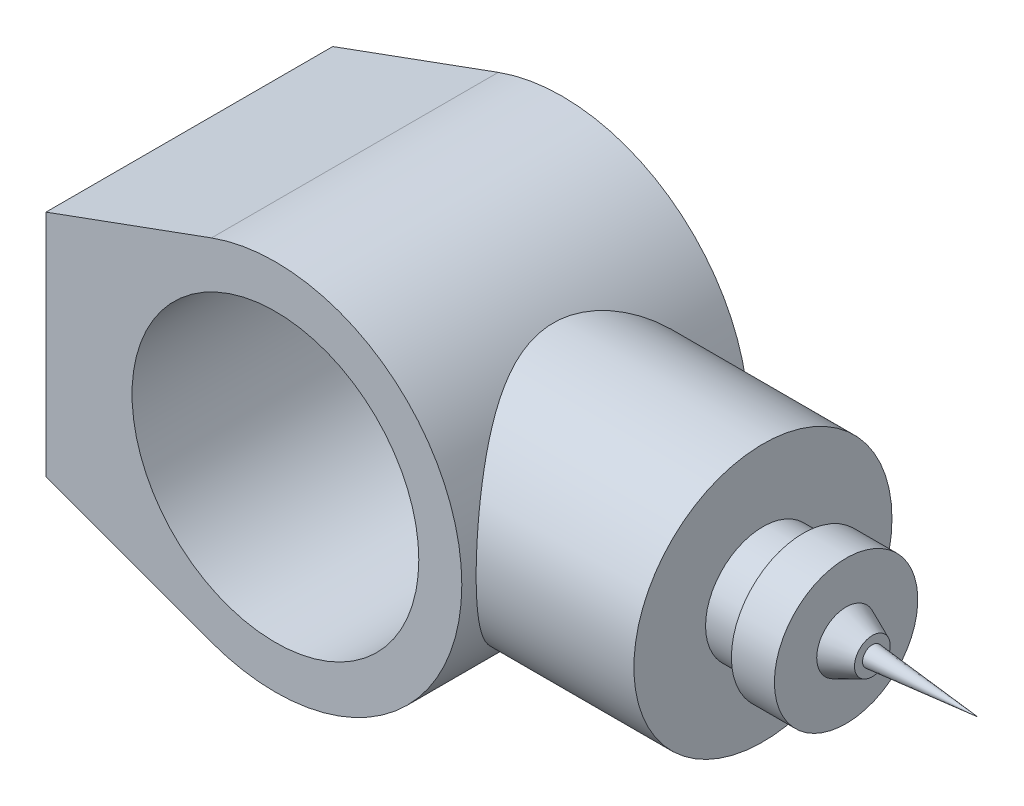
ISO-10303-21;
HEADER;
FILE_DESCRIPTION(('STEP AP214'),'2;1');
FILE_NAME('part.step','',(''),(''),'','','');
FILE_SCHEMA(('AUTOMOTIVE_DESIGN { 1 0 10303 214 1 1 1 1 }'));
ENDSEC;
DATA;
#1=APPLICATION_CONTEXT('core data for automotive mechanical design processes');
#2=APPLICATION_PROTOCOL_DEFINITION('international standard','automotive_design',2000,#1);
#3=PRODUCT_CONTEXT('',#1,'mechanical');
#4=PRODUCT('Part','Part','',(#3));
#5=PRODUCT_RELATED_PRODUCT_CATEGORY('part','',(#4));
#6=PRODUCT_DEFINITION_FORMATION('','',#4);
#7=PRODUCT_DEFINITION_CONTEXT('part definition',#1,'design');
#8=PRODUCT_DEFINITION('design','',#6,#7);
#9=PRODUCT_DEFINITION_SHAPE('','',#8);
#10=(LENGTH_UNIT() NAMED_UNIT(*) SI_UNIT(.MILLI.,.METRE.));
#11=(NAMED_UNIT(*) PLANE_ANGLE_UNIT() SI_UNIT($,.RADIAN.));
#12=(NAMED_UNIT(*) SI_UNIT($,.STERADIAN.) SOLID_ANGLE_UNIT());
#13=UNCERTAINTY_MEASURE_WITH_UNIT(LENGTH_MEASURE(1.E-05),#10,'distance_accuracy_value','');
#14=(GEOMETRIC_REPRESENTATION_CONTEXT(3) GLOBAL_UNCERTAINTY_ASSIGNED_CONTEXT((#13)) GLOBAL_UNIT_ASSIGNED_CONTEXT((#10,
#11,#12)) REPRESENTATION_CONTEXT('',''));
#15=CARTESIAN_POINT('',(0.,0.,0.));
#16=DIRECTION('',(0.,0.,1.));
#17=DIRECTION('',(1.,0.,0.));
#18=AXIS2_PLACEMENT_3D('',#15,#16,#17);
#19=CARTESIAN_POINT('',(0.,0.,50.));
#20=DIRECTION('',(0.,0.,1.));
#21=DIRECTION('',(1.,0.,0.));
#22=AXIS2_PLACEMENT_3D('',#19,#20,#21);
#23=PLANE('',#22);
#24=DIRECTION('',(-0.939410286372225,-0.342794856813887,0.));
#25=VECTOR('',#24,1.);
#26=CARTESIAN_POINT('',(-80.,40.,50.));
#27=LINE('',#26,#25);
#28=CARTESIAN_POINT('',(-22.2816656929027,61.0616686141947,50.));
#29=VERTEX_POINT('',#28);
#30=CARTESIAN_POINT('',(-80.,40.,50.));
#31=VERTEX_POINT('',#30);
#32=EDGE_CURVE('E200',#29,#31,#27,.T.);
#33=ORIENTED_EDGE('',*,*,#32,.T.);
#34=DIRECTION('',(0.,-1.,0.));
#35=VECTOR('',#34,1.);
#36=CARTESIAN_POINT('',(-80.,-40.,50.));
#37=LINE('',#36,#35);
#38=CARTESIAN_POINT('',(-80.,-40.,50.));
#39=VERTEX_POINT('',#38);
#40=EDGE_CURVE('E91',#31,#39,#37,.T.);
#41=ORIENTED_EDGE('',*,*,#40,.T.);
#42=DIRECTION('',(0.939410286372225,-0.342794856813887,0.));
#43=VECTOR('',#42,1.);
#44=CARTESIAN_POINT('',(-80.,-40.,50.));
#45=LINE('',#44,#43);
#46=CARTESIAN_POINT('',(-22.2816656929027,-61.0616686141947,50.));
#47=VERTEX_POINT('',#46);
#48=EDGE_CURVE('E193',#39,#47,#45,.T.);
#49=ORIENTED_EDGE('',*,*,#48,.T.);
#50=CARTESIAN_POINT('',(0.,0.,50.));
#51=DIRECTION('',(0.,0.,1.));
#52=DIRECTION('',(1.,0.,0.));
#53=AXIS2_PLACEMENT_3D('',#50,#51,#52);
#54=CIRCLE('',#53,65.);
#55=EDGE_CURVE('E60',#47,#29,#54,.T.);
#56=ORIENTED_EDGE('',*,*,#55,.T.);
#57=EDGE_LOOP('',(#33,#41,#49,#56));
#58=FACE_BOUND('',#57,.T.);
#59=CARTESIAN_POINT('',(0.,0.,50.));
#60=DIRECTION('',(0.,0.,1.));
#61=DIRECTION('',(1.,0.,0.));
#62=AXIS2_PLACEMENT_3D('',#59,#60,#61);
#63=CIRCLE('',#62,50.);
#64=CARTESIAN_POINT('',(50.,0.,50.));
#65=VERTEX_POINT('',#64);
#66=EDGE_CURVE('E215',#65,#65,#63,.T.);
#67=ORIENTED_EDGE('',*,*,#66,.F.);
#68=EDGE_LOOP('',(#67));
#69=FACE_BOUND('',#68,.T.);
#70=ADVANCED_FACE('F42',(#58,#69),#23,.T.);
#71=CARTESIAN_POINT('',(0.,0.,-50.));
#72=DIRECTION('',(0.,0.,1.));
#73=DIRECTION('',(1.,0.,0.));
#74=AXIS2_PLACEMENT_3D('',#71,#72,#73);
#75=PLANE('',#74);
#76=DIRECTION('',(-0.939410286372225,-0.342794856813887,0.));
#77=VECTOR('',#76,1.);
#78=CARTESIAN_POINT('',(-80.,40.,-50.));
#79=LINE('',#78,#77);
#80=CARTESIAN_POINT('',(-22.2816656929027,61.0616686141947,-50.));
#81=VERTEX_POINT('',#80);
#82=CARTESIAN_POINT('',(-80.,40.,-50.));
#83=VERTEX_POINT('',#82);
#84=EDGE_CURVE('E191',#81,#83,#79,.T.);
#85=ORIENTED_EDGE('',*,*,#84,.F.);
#86=CARTESIAN_POINT('',(0.,0.,-50.));
#87=DIRECTION('',(0.,0.,1.));
#88=DIRECTION('',(1.,0.,0.));
#89=AXIS2_PLACEMENT_3D('',#86,#87,#88);
#90=CIRCLE('',#89,65.);
#91=CARTESIAN_POINT('',(-22.2816656929027,-61.0616686141947,-50.));
#92=VERTEX_POINT('',#91);
#93=EDGE_CURVE('E84',#92,#81,#90,.T.);
#94=ORIENTED_EDGE('',*,*,#93,.F.);
#95=DIRECTION('',(0.939410286372225,-0.342794856813887,0.));
#96=VECTOR('',#95,1.);
#97=CARTESIAN_POINT('',(-80.,-40.,-50.));
#98=LINE('',#97,#96);
#99=CARTESIAN_POINT('',(-80.,-40.,-50.));
#100=VERTEX_POINT('',#99);
#101=EDGE_CURVE('E78',#100,#92,#98,.T.);
#102=ORIENTED_EDGE('',*,*,#101,.F.);
#103=DIRECTION('',(0.,-1.,0.));
#104=VECTOR('',#103,1.);
#105=CARTESIAN_POINT('',(-80.,-40.,-50.));
#106=LINE('',#105,#104);
#107=EDGE_CURVE('E185',#83,#100,#106,.T.);
#108=ORIENTED_EDGE('',*,*,#107,.F.);
#109=EDGE_LOOP('',(#85,#94,#102,#108));
#110=FACE_BOUND('',#109,.T.);
#111=CARTESIAN_POINT('',(0.,0.,-50.));
#112=DIRECTION('',(0.,0.,1.));
#113=DIRECTION('',(1.,0.,0.));
#114=AXIS2_PLACEMENT_3D('',#111,#112,#113);
#115=CIRCLE('',#114,50.);
#116=CARTESIAN_POINT('',(50.,0.,-50.));
#117=VERTEX_POINT('',#116);
#118=EDGE_CURVE('E218',#117,#117,#115,.T.);
#119=ORIENTED_EDGE('',*,*,#118,.T.);
#120=EDGE_LOOP('',(#119));
#121=FACE_BOUND('',#120,.T.);
#122=ADVANCED_FACE('F165',(#110,#121),#75,.F.);
#123=CARTESIAN_POINT('',(-80.,40.,50.));
#124=DIRECTION('',(0.342794856813887,-0.939410286372225,0.));
#125=DIRECTION('',(0.939410286372225,0.342794856813887,0.));
#126=AXIS2_PLACEMENT_3D('',#123,#124,#125);
#127=PLANE('',#126);
#128=ORIENTED_EDGE('',*,*,#84,.T.);
#129=DIRECTION('',(0.,0.,-1.));
#130=VECTOR('',#129,1.);
#131=CARTESIAN_POINT('',(-80.,40.,50.));
#132=LINE('',#131,#130);
#133=EDGE_CURVE('E11',#31,#83,#132,.T.);
#134=ORIENTED_EDGE('',*,*,#133,.F.);
#135=ORIENTED_EDGE('',*,*,#32,.F.);
#136=DIRECTION('',(0.,0.,-1.));
#137=VECTOR('',#136,1.);
#138=CARTESIAN_POINT('',(-22.2816656929027,61.0616686141947,50.));
#139=LINE('',#138,#137);
#140=EDGE_CURVE('E204',#29,#81,#139,.T.);
#141=ORIENTED_EDGE('',*,*,#140,.T.);
#142=EDGE_LOOP('',(#128,#134,#135,#141));
#143=FACE_BOUND('',#142,.T.);
#144=ADVANCED_FACE('F44',(#143),#127,.F.);
#145=CARTESIAN_POINT('',(-80.,-40.,50.));
#146=DIRECTION('',(1.,0.,0.));
#147=DIRECTION('',(0.,0.,-1.));
#148=AXIS2_PLACEMENT_3D('',#145,#146,#147);
#149=PLANE('',#148);
#150=ORIENTED_EDGE('',*,*,#107,.T.);
#151=DIRECTION('',(0.,0.,-1.));
#152=VECTOR('',#151,1.);
#153=CARTESIAN_POINT('',(-80.,-40.,50.));
#154=LINE('',#153,#152);
#155=EDGE_CURVE('E52',#39,#100,#154,.T.);
#156=ORIENTED_EDGE('',*,*,#155,.F.);
#157=ORIENTED_EDGE('',*,*,#40,.F.);
#158=ORIENTED_EDGE('',*,*,#133,.T.);
#159=EDGE_LOOP('',(#150,#156,#157,#158));
#160=FACE_BOUND('',#159,.T.);
#161=ADVANCED_FACE('F179',(#160),#149,.F.);
#162=CARTESIAN_POINT('',(-80.,-40.,50.));
#163=DIRECTION('',(0.342794856813887,0.939410286372225,0.));
#164=DIRECTION('',(-0.939410286372225,0.342794856813887,0.));
#165=AXIS2_PLACEMENT_3D('',#162,#163,#164);
#166=PLANE('',#165);
#167=ORIENTED_EDGE('',*,*,#101,.T.);
#168=DIRECTION('',(0.,0.,-1.));
#169=VECTOR('',#168,1.);
#170=CARTESIAN_POINT('',(-22.2816656929027,-61.0616686141947,50.));
#171=LINE('',#170,#169);
#172=EDGE_CURVE('E195',#47,#92,#171,.T.);
#173=ORIENTED_EDGE('',*,*,#172,.F.);
#174=ORIENTED_EDGE('',*,*,#48,.F.);
#175=ORIENTED_EDGE('',*,*,#155,.T.);
#176=EDGE_LOOP('',(#167,#173,#174,#175));
#177=FACE_BOUND('',#176,.T.);
#178=ADVANCED_FACE('F176',(#177),#166,.F.);
#179=CARTESIAN_POINT('',(0.,0.,50.));
#180=DIRECTION('',(0.,0.,-1.));
#181=DIRECTION('',(-1.,0.,0.));
#182=AXIS2_PLACEMENT_3D('',#179,#180,#181);
#183=CYLINDRICAL_SURFACE('',#182,65.);
#184=CARTESIAN_POINT('',(65.,0.,-45.));
#185=CARTESIAN_POINT('',(65.0000011696057,1.12147330120565,-45.0000012025283));
#186=CARTESIAN_POINT('',(64.9709159765212,2.24292945230778,-44.9580201602482));
#187=CARTESIAN_POINT('',(64.8553068641383,4.47658414079082,-44.790785609369));
#188=CARTESIAN_POINT('',(64.7687842573088,5.58878288911931,-44.6655340035371));
#189=CARTESIAN_POINT('',(64.5403785763001,7.79555151848628,-44.3336771879691));
#190=CARTESIAN_POINT('',(64.3984760503456,8.89011506447751,-44.1270433931238));
#191=CARTESIAN_POINT('',(64.0626457436966,11.0533096019768,-43.6354760134034));
#192=CARTESIAN_POINT('',(63.8687169569864,12.1219400915896,-43.3505409144375));
#193=CARTESIAN_POINT('',(63.4342222744662,14.2212125160505,-42.7078017297046));
#194=CARTESIAN_POINT('',(63.1938918545645,15.2520162370063,-42.3503651251477));
#195=CARTESIAN_POINT('',(62.6709259446924,17.2756280115286,-41.5659763086892));
#196=CARTESIAN_POINT('',(62.3882907364915,18.268436318107,-41.1390245597888));
#197=CARTESIAN_POINT('',(61.786108553932,20.2116697228795,-40.2199419970838));
#198=CARTESIAN_POINT('',(61.4665619062631,21.1620951960855,-39.7278117601444));
#199=CARTESIAN_POINT('',(60.7962171584065,23.0172309124314,-38.6825647509799));
#200=CARTESIAN_POINT('',(60.4454175300334,23.9219389167185,-38.1294449962195));
#201=CARTESIAN_POINT('',(59.6865648974474,25.7601880140228,-36.9151737617935));
#202=CARTESIAN_POINT('',(59.27618815402,26.6893215363404,-36.2488040005491));
#203=CARTESIAN_POINT('',(58.4330275057249,28.4880338622967,-34.8529502059224));
#204=CARTESIAN_POINT('',(58.0002425478181,29.3576098626539,-34.1234632053608));
#205=CARTESIAN_POINT('',(57.1195111836477,31.0364486388513,-32.6040251352403));
#206=CARTESIAN_POINT('',(56.6715447181891,31.8456267033451,-31.8139921794123));
#207=CARTESIAN_POINT('',(55.7691986061138,33.4006700551814,-30.1773036556993));
#208=CARTESIAN_POINT('',(55.3148185876119,34.1465316534289,-29.3306447936721));
#209=CARTESIAN_POINT('',(54.3303114345595,35.6959084068904,-27.4326466159468));
#210=CARTESIAN_POINT('',(53.8005937511269,36.4872853280241,-26.3711450656527));
#211=CARTESIAN_POINT('',(52.7593327891933,37.9773509509911,-24.17604025639));
#212=CARTESIAN_POINT('',(52.2477941160227,38.6760162868262,-23.0424189272517));
#213=CARTESIAN_POINT('',(51.2608149265043,39.9749077721744,-20.7072341856928));
#214=CARTESIAN_POINT('',(50.7853275075273,40.5752630453964,-19.5057627267967));
#215=CARTESIAN_POINT('',(49.8892399163793,41.6721166930025,-17.036931864064));
#216=CARTESIAN_POINT('',(49.4686114171658,42.1686687478853,-15.7696069409943));
#217=CARTESIAN_POINT('',(48.8208029416879,42.9149535309565,-13.5723996352816));
#218=CARTESIAN_POINT('',(48.5738420263557,43.1936925213245,-12.6581208440976));
#219=CARTESIAN_POINT('',(48.1238801744123,43.6944569649788,-10.8035389223551));
#220=CARTESIAN_POINT('',(47.9208721021929,43.9164916250901,-9.86324004407419));
#221=CARTESIAN_POINT('',(47.5660754926548,44.3005296261305,-7.96250438663409));
#222=CARTESIAN_POINT('',(47.4142038087044,44.4626304606427,-7.00210302149487));
#223=CARTESIAN_POINT('',(47.1671263845177,44.7246555122386,-5.06554052628518));
#224=CARTESIAN_POINT('',(47.0719206259529,44.824579749433,-4.08937940131224));
#225=CARTESIAN_POINT('',(46.9418899090943,44.9607388198673,-2.1232364847967));
#226=CARTESIAN_POINT('',(46.9073939345417,44.9966266570423,-1.13320851844658));
#227=CARTESIAN_POINT('',(46.9013571135476,45.0029190462422,0.847248377093852));
#228=CARTESIAN_POINT('',(46.9298161498631,44.9733237202183,1.837677305534));
#229=CARTESIAN_POINT('',(47.0484302849821,44.8492190899201,3.81128752429081));
#230=CARTESIAN_POINT('',(47.13862305521,44.7546701492421,4.79446401850661));
#231=CARTESIAN_POINT('',(47.3768313176079,44.5024241630868,6.74551496467455));
#232=CARTESIAN_POINT('',(47.5248480621437,44.3447257499009,7.71338908473168));
#233=CARTESIAN_POINT('',(47.8621764271841,43.9803320764262,9.56919366964684));
#234=CARTESIAN_POINT('',(48.0484149088864,43.7772163066585,10.4583970625519));
#235=CARTESIAN_POINT('',(48.4609441046406,43.32010640119,12.2144143492181));
#236=CARTESIAN_POINT('',(48.6872496045115,43.0660934784815,13.0812198417583));
#237=CARTESIAN_POINT('',(49.1738509640383,42.5096331932465,14.7898225666927));
#238=CARTESIAN_POINT('',(49.4341648638834,42.2071601049958,15.6316062329481));
#239=CARTESIAN_POINT('',(49.9825182796335,41.5563350032134,17.2876417419013));
#240=CARTESIAN_POINT('',(50.2705534011697,41.2079902580444,18.1018979206949));
#241=CARTESIAN_POINT('',(51.0225431471345,40.2767822129268,20.1137766396802));
#242=CARTESIAN_POINT('',(51.5007434523328,39.6654891440572,21.2930273345177));
#243=CARTESIAN_POINT('',(52.4891158781477,38.348029920852,23.5833678403921));
#244=CARTESIAN_POINT('',(52.9993005340589,37.6418264436726,24.6944305853524));
#245=CARTESIAN_POINT('',(54.0361557973494,36.1376496350166,26.8476775780095));
#246=CARTESIAN_POINT('',(54.5628535785461,35.3395185623559,27.8897384505711));
#247=CARTESIAN_POINT('',(55.6171804467178,33.6558443419671,29.8998791095632));
#248=CARTESIAN_POINT('',(56.1448094104418,32.7703120184234,30.8679680307498));
#249=CARTESIAN_POINT('',(57.1932449701135,30.9045304086319,32.7363921475659));
#250=CARTESIAN_POINT('',(57.7139191350983,29.9233731295192,33.6358963165067));
#251=CARTESIAN_POINT('',(58.7296419536465,27.8771206485979,35.350355349792));
#252=CARTESIAN_POINT('',(59.2246882700661,26.8120178135979,36.1653025097018));
#253=CARTESIAN_POINT('',(60.1756566955639,24.6035209522421,37.7024332048813));
#254=CARTESIAN_POINT('',(60.6316475651595,23.4602711709794,38.4247809320632));
#255=CARTESIAN_POINT('',(61.4931891608211,21.0989507187335,39.7703323765769));
#256=CARTESIAN_POINT('',(61.898755017873,19.8809026570889,40.3935658507715));
#257=CARTESIAN_POINT('',(62.5646802947783,17.6549035875762,41.4059204565395));
#258=CARTESIAN_POINT('',(62.8372982548467,16.6602403417733,41.8163120535009));
#259=CARTESIAN_POINT('',(63.3397164077328,14.6345031625144,42.5675669112335));
#260=CARTESIAN_POINT('',(63.569522535998,13.603434299959,42.9084398107234));
#261=CARTESIAN_POINT('',(63.9815049902596,11.5110112910016,43.5164676119118));
#262=CARTESIAN_POINT('',(64.1637052650743,10.4496726714621,43.7836595836378));
#263=CARTESIAN_POINT('',(64.476639865795,8.30296993183371,44.2409869387356));
#264=CARTESIAN_POINT('',(64.6073730982257,7.21760530180254,44.431120684921));
#265=CARTESIAN_POINT('',(64.8147345736682,5.02649787175023,44.7321113931983));
#266=CARTESIAN_POINT('',(64.8911534961694,3.92069290489763,44.8426616714377));
#267=CARTESIAN_POINT('',(64.9872183357685,1.70145350776208,44.981563734156));
#268=CARTESIAN_POINT('',(65.0068642771874,0.588019080747696,45.0099155538474));
#269=CARTESIAN_POINT('',(64.9889001241945,-1.63741781931566,44.9839662509349));
#270=CARTESIAN_POINT('',(64.9512898349751,-2.74942028747967,44.929664847113));
#271=CARTESIAN_POINT('',(64.819734418053,-4.96298947367603,44.7392747901952));
#272=CARTESIAN_POINT('',(64.7257910494465,-6.06455651648127,44.6031886909653));
#273=CARTESIAN_POINT('',(64.491175703309,-8.18254449212149,44.2620157992034));
#274=CARTESIAN_POINT('',(64.3536808680178,-9.20007959997774,44.0616107864454));
#275=CARTESIAN_POINT('',(64.0337856060908,-11.2121337136589,43.5930613516679));
#276=CARTESIAN_POINT('',(63.8513873855499,-12.2066538475799,43.3249202574929));
#277=CARTESIAN_POINT('',(63.4451725249075,-14.1673074608523,42.7239854011605));
#278=CARTESIAN_POINT('',(63.2213525684632,-15.1334386601223,42.3911864622047));
#279=CARTESIAN_POINT('',(62.736336352677,-17.0327019487273,41.6643868113868));
#280=CARTESIAN_POINT('',(62.4751380044848,-17.965832190203,41.2703826790343));
#281=CARTESIAN_POINT('',(61.8990085085122,-19.8637431772395,40.3931275129008));
#282=CARTESIAN_POINT('',(61.5815209528501,-20.8256806929253,39.9054081529014));
#283=CARTESIAN_POINT('',(60.9142086391395,-22.7035764997345,38.8677076181211));
#284=CARTESIAN_POINT('',(60.5643826081083,-23.6195329786528,38.3177239921568));
#285=CARTESIAN_POINT('',(59.8381347129401,-25.4032558353403,37.1592008079418));
#286=CARTESIAN_POINT('',(59.4616987975441,-26.270996314329,36.5506302507532));
#287=CARTESIAN_POINT('',(58.6884577670336,-27.9557544991496,35.2787474176625));
#288=CARTESIAN_POINT('',(58.2916515549571,-28.7727694681138,34.6154321925309));
#289=CARTESIAN_POINT('',(57.4151711853793,-30.4889708749912,33.1199200847161));
#290=CARTESIAN_POINT('',(56.9328754552547,-31.3785212006928,32.2781812569548));
#291=CARTESIAN_POINT('',(55.9590893109094,-33.0839042215169,30.5278352445589));
#292=CARTESIAN_POINT('',(55.4675975421249,-33.8997259516808,29.6192181500899));
#293=CARTESIAN_POINT('',(54.4860350387397,-35.45586994741,27.7375714933993));
#294=CARTESIAN_POINT('',(53.9959654596117,-36.1961418986443,26.7644997080007));
#295=CARTESIAN_POINT('',(53.0294834997435,-37.5978502361011,24.7568233036382));
#296=CARTESIAN_POINT('',(52.553069328415,-38.2592969946585,23.7222268074148));
#297=CARTESIAN_POINT('',(51.679941347726,-39.4291013564639,21.7149007388747));
#298=CARTESIAN_POINT('',(51.2803372484816,-39.9463152685162,20.7485884228094));
#299=CARTESIAN_POINT('',(50.5123974548912,-40.9130636661729,18.7705314851885));
#300=CARTESIAN_POINT('',(50.1440619804653,-41.3625976757848,17.7587865441704));
#301=CARTESIAN_POINT('',(49.4504928922364,-42.1893301292689,15.693797265063));
#302=CARTESIAN_POINT('',(49.1251906412473,-42.566644202947,14.6406225749502));
#303=CARTESIAN_POINT('',(48.5290098021012,-43.2451098617227,12.4950157035289));
#304=CARTESIAN_POINT('',(48.2581179989952,-43.5462799449171,11.4025931307277));
#305=CARTESIAN_POINT('',(47.8271610412375,-44.0186874861181,9.3921629994351));
#306=CARTESIAN_POINT('',(47.6558419905218,-44.2036946073207,8.47979353570419));
#307=CARTESIAN_POINT('',(47.3627606953031,-44.517583244497,6.63757582668245));
#308=CARTESIAN_POINT('',(47.2409923142224,-44.6464717105955,5.70772976070373));
#309=CARTESIAN_POINT('',(47.05166615705,-44.8459556683364,3.83718735816971));
#310=CARTESIAN_POINT('',(46.9840561376509,-44.9166073394187,2.89650236820514));
#311=CARTESIAN_POINT('',(46.9055698265682,-44.9985645522097,1.01014116515035));
#312=CARTESIAN_POINT('',(46.894694331428,-45.0098692606967,0.0644648821697862));
#313=CARTESIAN_POINT('',(46.9301408777119,-44.972908524549,-1.82506201386804));
#314=CARTESIAN_POINT('',(46.9764888551696,-44.9246160680299,-2.76891160474201));
#315=CARTESIAN_POINT('',(47.1245232303033,-44.7693052695385,-4.64731891289862));
#316=CARTESIAN_POINT('',(47.226209296244,-44.6622872796082,-5.58187668584874));
#317=CARTESIAN_POINT('',(47.4811423262629,-44.3911660407895,-7.43666598606561));
#318=CARTESIAN_POINT('',(47.634452919394,-44.2269923369625,-8.35687836049678));
#319=CARTESIAN_POINT('',(47.9871889035597,-43.8440109221367,-10.1768310643423));
#320=CARTESIAN_POINT('',(48.1866204648689,-43.6251959006593,-11.0765686368372));
#321=CARTESIAN_POINT('',(48.6908782922366,-43.0625185245671,-13.116726178063));
#322=CARTESIAN_POINT('',(49.0093972350599,-42.7008255731353,-14.2488681052183));
#323=CARTESIAN_POINT('',(49.699554494161,-41.8955268796886,-16.4668795226373));
#324=CARTESIAN_POINT('',(50.0712093704162,-41.4518955887103,-17.5527344499461));
#325=CARTESIAN_POINT('',(50.8544123719762,-40.4872212981013,-19.6760329984318));
#326=CARTESIAN_POINT('',(51.2660067549033,-39.9660881554129,-20.7134183727638));
#327=CARTESIAN_POINT('',(52.116211879306,-38.8508952329155,-22.7363587217865));
#328=CARTESIAN_POINT('',(52.5548209260535,-38.2568400254561,-23.7219169406072));
#329=CARTESIAN_POINT('',(53.4579357785502,-36.9847423381263,-25.6613286822633));
#330=CARTESIAN_POINT('',(53.9228021101371,-36.3051118639051,-26.6139712103077));
#331=CARTESIAN_POINT('',(54.8583333343946,-34.8753950985048,-28.4617532840731));
#332=CARTESIAN_POINT('',(55.3289982185488,-34.1253089107936,-29.3568929142368));
#333=CARTESIAN_POINT('',(56.2664339133503,-32.5564691651912,-31.0876310121466));
#334=CARTESIAN_POINT('',(56.7332035093429,-31.7376950080829,-31.923211478402));
#335=CARTESIAN_POINT('',(57.6535165855435,-30.033481652025,-33.5315189390535));
#336=CARTESIAN_POINT('',(58.1070588196762,-29.1480362003111,-34.3042400240121));
#337=CARTESIAN_POINT('',(59.0635284336244,-27.1643113596245,-35.9022819462667));
#338=CARTESIAN_POINT('',(59.5626106290919,-26.0547472869609,-36.7159606163356));
#339=CARTESIAN_POINT('',(60.5176757229357,-23.7521280348398,-38.2458641369291));
#340=CARTESIAN_POINT('',(60.9736519283074,-22.5590599397198,-38.962073861155));
#341=CARTESIAN_POINT('',(61.6149926579414,-20.7127348127311,-39.9558623322098));
#342=CARTESIAN_POINT('',(61.8215919655179,-20.088110583999,-40.2735888165198));
#343=CARTESIAN_POINT('',(62.2191547005856,-18.8206694867556,-40.8812436548858));
#344=CARTESIAN_POINT('',(62.4101203779565,-18.1778552539997,-41.1711760099034));
#345=CARTESIAN_POINT('',(62.7748527233683,-16.875283117665,-41.7219931318356));
#346=CARTESIAN_POINT('',(62.9486230408552,-16.2155288469421,-41.9828840638124));
#347=CARTESIAN_POINT('',(63.2775356475737,-14.8804011558233,-42.4744610119283));
#348=CARTESIAN_POINT('',(63.432679284421,-14.2050288695917,-42.7051492133046));
#349=CARTESIAN_POINT('',(63.8070721968101,-12.4447010544915,-43.25974494481));
#350=CARTESIAN_POINT('',(64.0114184468014,-11.3490405228654,-43.5602757498286));
#351=CARTESIAN_POINT('',(64.3654191982087,-9.12991345978806,-44.078827644396));
#352=CARTESIAN_POINT('',(64.5150820049425,-8.00645117856259,-44.2968612637911));
#353=CARTESIAN_POINT('',(64.7559993187061,-5.74082253729113,-44.6470112993716));
#354=CARTESIAN_POINT('',(64.847297757104,-4.59867091062173,-44.7791923387443));
#355=CARTESIAN_POINT('',(64.9692976296881,-2.30434018473195,-44.9556862638234));
#356=CARTESIAN_POINT('',(64.9999987983895,-1.15216104160189,-44.999998764566));
#357=CARTESIAN_POINT('',(65.,0.,-45.));
#358=B_SPLINE_CURVE_WITH_KNOTS('',3,(#184,#185,#186,#187,#188,#189,#190,#191,#192,#193,#194,
#195,#196,#197,#198,#199,#200,#201,#202,#203,#204,#205,#206,#207,#208,#209,#210,#211,#212,#213,
#214,#215,#216,#217,#218,#219,#220,#221,#222,#223,#224,#225,#226,#227,#228,#229,#230,#231,#232,
#233,#234,#235,#236,#237,#238,#239,#240,#241,#242,#243,#244,#245,#246,#247,#248,#249,#250,#251,
#252,#253,#254,#255,#256,#257,#258,#259,#260,#261,#262,#263,#264,#265,#266,#267,#268,#269,#270,
#271,#272,#273,#274,#275,#276,#277,#278,#279,#280,#281,#282,#283,#284,#285,#286,#287,#288,#289,
#290,#291,#292,#293,#294,#295,#296,#297,#298,#299,#300,#301,#302,#303,#304,#305,#306,#307,#308,
#309,#310,#311,#312,#313,#314,#315,#316,#317,#318,#319,#320,#321,#322,#323,#324,#325,#326,#327,
#328,#329,#330,#331,#332,#333,#334,#335,#336,#337,#338,#339,#340,#341,#342,#343,#344,#345,#346,
#347,#348,#349,#350,#351,#352,#353,#354,#355,#356,#357),.UNSPECIFIED.,.T.,.F.,(4,2,2,2,2,2,2,2,
2,2,2,2,2,2,2,2,2,2,2,2,2,2,2,2,2,2,2,2,2,2,2,2,2,2,2,2,2,2,2,2,2,2,2,2,2,2,2,2,2,2,2,2,2,2,2,2,
2,2,2,2,2,2,2,2,2,2,2,2,2,2,2,2,2,2,2,2,2,2,2,2,2,2,2,2,2,2,4),(0.,3.36323892794144,
6.72640100710137,10.0907454360665,13.4551549250109,16.8029195613731,20.1506619010729,
23.4983746134034,26.8462511096753,30.4871649037346,34.1282499524345,37.7743494260164,
41.4206611917409,45.6939383064405,49.9682903731881,54.2369825353392,58.5034617073671,
61.4625138492405,64.4210852373372,67.3748225577202,70.3285589227263,73.2982527376573,
76.2679410220407,79.2394430998938,82.2110095388412,85.0011411726389,87.7923045951578,
90.584954683776,93.3771628083065,97.6064034875675,101.837312178738,106.075592113262,
110.313347816192,114.596218662803,118.879479402292,123.155037051935,127.429308626693,
130.755998382163,134.082226580387,137.406778235214,140.731400520075,144.068767009318,
147.406132068879,150.743508483461,154.080780688207,157.215791533369,160.350648386749,
163.485756334407,166.621039552604,169.990545063149,173.360183268584,176.73161428665,
180.103227050672,184.047902440152,187.993163521895,191.94103513809,195.888386692538,
199.385185586645,202.88200907258,206.373186157811,209.863514294626,212.700365177753,
215.536864625513,218.370624567028,221.204424293963,224.039508887241,226.874576485218,
229.713151272815,232.55210603787,236.23803941247,239.925124033801,243.616531168718,
247.307706963636,251.081871120678,254.856029735252,258.631324277359,262.406973327354,
266.792058434818,271.177823293658,273.368885604935,275.55963203795,277.749912517597,
279.940034437727,283.398420446896,286.856280978073,290.31153567335,293.766805506531),.UNSPECIFIED.);
#359=CARTESIAN_POINT('',(65.,0.,-45.));
#360=VERTEX_POINT('',#359);
#361=EDGE_CURVE('E131',#360,#360,#358,.T.);
#362=ORIENTED_EDGE('',*,*,#361,.F.);
#363=EDGE_LOOP('',(#362));
#364=FACE_BOUND('',#363,.T.);
#365=ORIENTED_EDGE('',*,*,#93,.T.);
#366=ORIENTED_EDGE('',*,*,#140,.F.);
#367=ORIENTED_EDGE('',*,*,#55,.F.);
#368=ORIENTED_EDGE('',*,*,#172,.T.);
#369=EDGE_LOOP('',(#365,#366,#367,#368));
#370=FACE_BOUND('',#369,.T.);
#371=ADVANCED_FACE('F162',(#364,#370),#183,.T.);
#372=CARTESIAN_POINT('',(0.,0.,50.));
#373=DIRECTION('',(0.,0.,-1.));
#374=DIRECTION('',(-1.,0.,0.));
#375=AXIS2_PLACEMENT_3D('',#372,#373,#374);
#376=CYLINDRICAL_SURFACE('',#375,50.);
#377=ORIENTED_EDGE('',*,*,#66,.T.);
#378=EDGE_LOOP('',(#377));
#379=FACE_BOUND('',#378,.T.);
#380=ORIENTED_EDGE('',*,*,#118,.F.);
#381=EDGE_LOOP('',(#380));
#382=FACE_BOUND('',#381,.T.);
#383=ADVANCED_FACE('F153',(#379,#382),#376,.F.);
#384=CARTESIAN_POINT('',(-80.002,0.,0.));
#385=DIRECTION('',(1.,0.,0.));
#386=DIRECTION('',(0.,0.,-1.));
#387=AXIS2_PLACEMENT_3D('',#384,#385,#386);
#388=CYLINDRICAL_SURFACE('',#387,45.);
#389=CARTESIAN_POINT('',(120.,0.,0.));
#390=DIRECTION('',(1.,0.,0.));
#391=DIRECTION('',(0.,0.,-1.));
#392=AXIS2_PLACEMENT_3D('',#389,#390,#391);
#393=CIRCLE('',#392,45.);
#394=CARTESIAN_POINT('',(120.,0.,-45.));
#395=VERTEX_POINT('',#394);
#396=EDGE_CURVE('E140',#395,#395,#393,.T.);
#397=ORIENTED_EDGE('',*,*,#396,.F.);
#398=EDGE_LOOP('',(#397));
#399=FACE_BOUND('',#398,.T.);
#400=ORIENTED_EDGE('',*,*,#361,.T.);
#401=EDGE_LOOP('',(#400));
#402=FACE_BOUND('',#401,.T.);
#403=ADVANCED_FACE('F142',(#399,#402),#388,.T.);
#404=CARTESIAN_POINT('',(120.,0.,0.));
#405=DIRECTION('',(1.,0.,0.));
#406=DIRECTION('',(0.,0.,-1.));
#407=AXIS2_PLACEMENT_3D('',#404,#405,#406);
#408=PLANE('',#407);
#409=CARTESIAN_POINT('',(120.,0.,0.));
#410=DIRECTION('',(-1.,0.,0.));
#411=DIRECTION('',(0.,0.,1.));
#412=AXIS2_PLACEMENT_3D('',#409,#410,#411);
#413=CIRCLE('',#412,20.);
#414=CARTESIAN_POINT('',(120.,0.,20.));
#415=VERTEX_POINT('',#414);
#416=EDGE_CURVE('E127',#415,#415,#413,.T.);
#417=ORIENTED_EDGE('',*,*,#416,.T.);
#418=EDGE_LOOP('',(#417));
#419=FACE_BOUND('',#418,.T.);
#420=ORIENTED_EDGE('',*,*,#396,.T.);
#421=EDGE_LOOP('',(#420));
#422=FACE_BOUND('',#421,.T.);
#423=ADVANCED_FACE('F150',(#419,#422),#408,.T.);
#424=CARTESIAN_POINT('',(0.,0.,0.));
#425=DIRECTION('',(-1.,0.,0.));
#426=DIRECTION('',(0.,0.,1.));
#427=AXIS2_PLACEMENT_3D('',#424,#425,#426);
#428=CYLINDRICAL_SURFACE('',#427,20.);
#429=CARTESIAN_POINT('',(134.,0.,0.));
#430=DIRECTION('',(-1.,0.,0.));
#431=DIRECTION('',(0.,0.,1.));
#432=AXIS2_PLACEMENT_3D('',#429,#430,#431);
#433=CIRCLE('',#432,20.);
#434=CARTESIAN_POINT('',(134.,0.,20.));
#435=VERTEX_POINT('',#434);
#436=EDGE_CURVE('E123',#435,#435,#433,.T.);
#437=ORIENTED_EDGE('',*,*,#436,.T.);
#438=EDGE_LOOP('',(#437));
#439=FACE_BOUND('',#438,.T.);
#440=ORIENTED_EDGE('',*,*,#416,.F.);
#441=EDGE_LOOP('',(#440));
#442=FACE_BOUND('',#441,.T.);
#443=ADVANCED_FACE('F148',(#439,#442),#428,.T.);
#444=CARTESIAN_POINT('',(134.,-20.,0.));
#445=DIRECTION('',(-1.,0.,0.));
#446=DIRECTION('',(0.,0.,1.));
#447=AXIS2_PLACEMENT_3D('',#444,#445,#446);
#448=PLANE('',#447);
#449=CARTESIAN_POINT('',(134.,0.,0.));
#450=DIRECTION('',(-1.,0.,0.));
#451=DIRECTION('',(0.,0.,1.));
#452=AXIS2_PLACEMENT_3D('',#449,#450,#451);
#453=CIRCLE('',#452,25.);
#454=CARTESIAN_POINT('',(134.,0.,25.));
#455=VERTEX_POINT('',#454);
#456=EDGE_CURVE('E119',#455,#455,#453,.T.);
#457=ORIENTED_EDGE('',*,*,#456,.T.);
#458=EDGE_LOOP('',(#457));
#459=FACE_BOUND('',#458,.T.);
#460=ORIENTED_EDGE('',*,*,#436,.F.);
#461=EDGE_LOOP('',(#460));
#462=FACE_BOUND('',#461,.T.);
#463=ADVANCED_FACE('F157',(#459,#462),#448,.T.);
#464=CARTESIAN_POINT('',(0.,0.,0.));
#465=DIRECTION('',(-1.,0.,0.));
#466=DIRECTION('',(0.,0.,1.));
#467=AXIS2_PLACEMENT_3D('',#464,#465,#466);
#468=CYLINDRICAL_SURFACE('',#467,25.);
#469=CARTESIAN_POINT('',(149.,0.,0.));
#470=DIRECTION('',(-1.,0.,0.));
#471=DIRECTION('',(0.,0.,1.));
#472=AXIS2_PLACEMENT_3D('',#469,#470,#471);
#473=CIRCLE('',#472,25.);
#474=CARTESIAN_POINT('',(149.,0.,25.));
#475=VERTEX_POINT('',#474);
#476=EDGE_CURVE('E115',#475,#475,#473,.T.);
#477=ORIENTED_EDGE('',*,*,#476,.T.);
#478=EDGE_LOOP('',(#477));
#479=FACE_BOUND('',#478,.T.);
#480=ORIENTED_EDGE('',*,*,#456,.F.);
#481=EDGE_LOOP('',(#480));
#482=FACE_BOUND('',#481,.T.);
#483=ADVANCED_FACE('F290',(#479,#482),#468,.T.);
#484=CARTESIAN_POINT('',(149.,-25.,0.));
#485=DIRECTION('',(1.,0.,0.));
#486=DIRECTION('',(0.,0.,-1.));
#487=AXIS2_PLACEMENT_3D('',#484,#485,#486);
#488=PLANE('',#487);
#489=CARTESIAN_POINT('',(149.,0.,0.));
#490=DIRECTION('',(-1.,0.,0.));
#491=DIRECTION('',(0.,0.,1.));
#492=AXIS2_PLACEMENT_3D('',#489,#490,#491);
#493=CIRCLE('',#492,10.2435585199228);
#494=CARTESIAN_POINT('',(149.,0.,10.2435585199228));
#495=VERTEX_POINT('',#494);
#496=EDGE_CURVE('E109',#495,#495,#493,.T.);
#497=ORIENTED_EDGE('',*,*,#496,.T.);
#498=EDGE_LOOP('',(#497));
#499=FACE_BOUND('',#498,.T.);
#500=ORIENTED_EDGE('',*,*,#476,.F.);
#501=EDGE_LOOP('',(#500));
#502=FACE_BOUND('',#501,.T.);
#503=ADVANCED_FACE('F298',(#499,#502),#488,.T.);
#504=CARTESIAN_POINT('',(149.,0.,0.));
#505=DIRECTION('',(-1.,0.,0.));
#506=DIRECTION('',(0.,0.,1.));
#507=AXIS2_PLACEMENT_3D('',#504,#505,#506);
#508=CONICAL_SURFACE('',#507,10.2435585199228,0.413185896045516);
#509=CARTESIAN_POINT('',(158.158462427294,0.,0.));
#510=DIRECTION('',(-1.,0.,0.));
#511=DIRECTION('',(0.,0.,1.));
#512=AXIS2_PLACEMENT_3D('',#509,#510,#511);
#513=CIRCLE('',#512,6.22826700275344);
#514=CARTESIAN_POINT('',(158.158462427294,0.,6.22826700275344));
#515=VERTEX_POINT('',#514);
#516=EDGE_CURVE('E105',#515,#515,#513,.T.);
#517=ORIENTED_EDGE('',*,*,#516,.T.);
#518=EDGE_LOOP('',(#517));
#519=FACE_BOUND('',#518,.T.);
#520=ORIENTED_EDGE('',*,*,#496,.F.);
#521=EDGE_LOOP('',(#520));
#522=FACE_BOUND('',#521,.T.);
#523=ADVANCED_FACE('F308',(#519,#522),#508,.T.);
#524=CARTESIAN_POINT('',(158.158462427294,-6.22826700275344,0.));
#525=DIRECTION('',(1.,0.,0.));
#526=DIRECTION('',(0.,0.,-1.));
#527=AXIS2_PLACEMENT_3D('',#524,#525,#526);
#528=PLANE('',#527);
#529=CARTESIAN_POINT('',(158.158462427294,0.,0.));
#530=DIRECTION('',(-1.,0.,0.));
#531=DIRECTION('',(0.,0.,1.));
#532=AXIS2_PLACEMENT_3D('',#529,#530,#531);
#533=CIRCLE('',#532,3.42068842177439);
#534=CARTESIAN_POINT('',(158.158462427294,0.,3.42068842177439));
#535=VERTEX_POINT('',#534);
#536=EDGE_CURVE('E102',#535,#535,#533,.T.);
#537=ORIENTED_EDGE('',*,*,#536,.T.);
#538=EDGE_LOOP('',(#537));
#539=FACE_BOUND('',#538,.T.);
#540=ORIENTED_EDGE('',*,*,#516,.F.);
#541=EDGE_LOOP('',(#540));
#542=FACE_BOUND('',#541,.T.);
#543=ADVANCED_FACE('F98',(#539,#542),#528,.T.);
#544=CARTESIAN_POINT('',(158.158462427294,0.,0.));
#545=DIRECTION('',(-1.,0.,0.));
#546=DIRECTION('',(0.,0.,1.));
#547=AXIS2_PLACEMENT_3D('',#544,#545,#546);
#548=CONICAL_SURFACE('',#547,3.42068842177439,0.0925832470673911);
#549=CARTESIAN_POINT('',(195.,0.,0.));
#550=VERTEX_POINT('',#549);
#551=VERTEX_LOOP('',#550);
#552=FACE_BOUND('',#551,.T.);
#553=ORIENTED_EDGE('',*,*,#536,.F.);
#554=EDGE_LOOP('',(#553));
#555=FACE_BOUND('',#554,.T.);
#556=ADVANCED_FACE('F95',(#552,#555),#548,.T.);
#557=CLOSED_SHELL('',(#70,#122,#144,#161,#178,#371,#383,#403,#423,#443,#463,#483,#503,#523,#543,#556));
#558=MANIFOLD_SOLID_BREP('B2',#557);
#559=ADVANCED_BREP_SHAPE_REPRESENTATION('',(#18,#558),#14);
#560=SHAPE_DEFINITION_REPRESENTATION(#9,#559);
ENDSEC;
END-ISO-10303-21;
